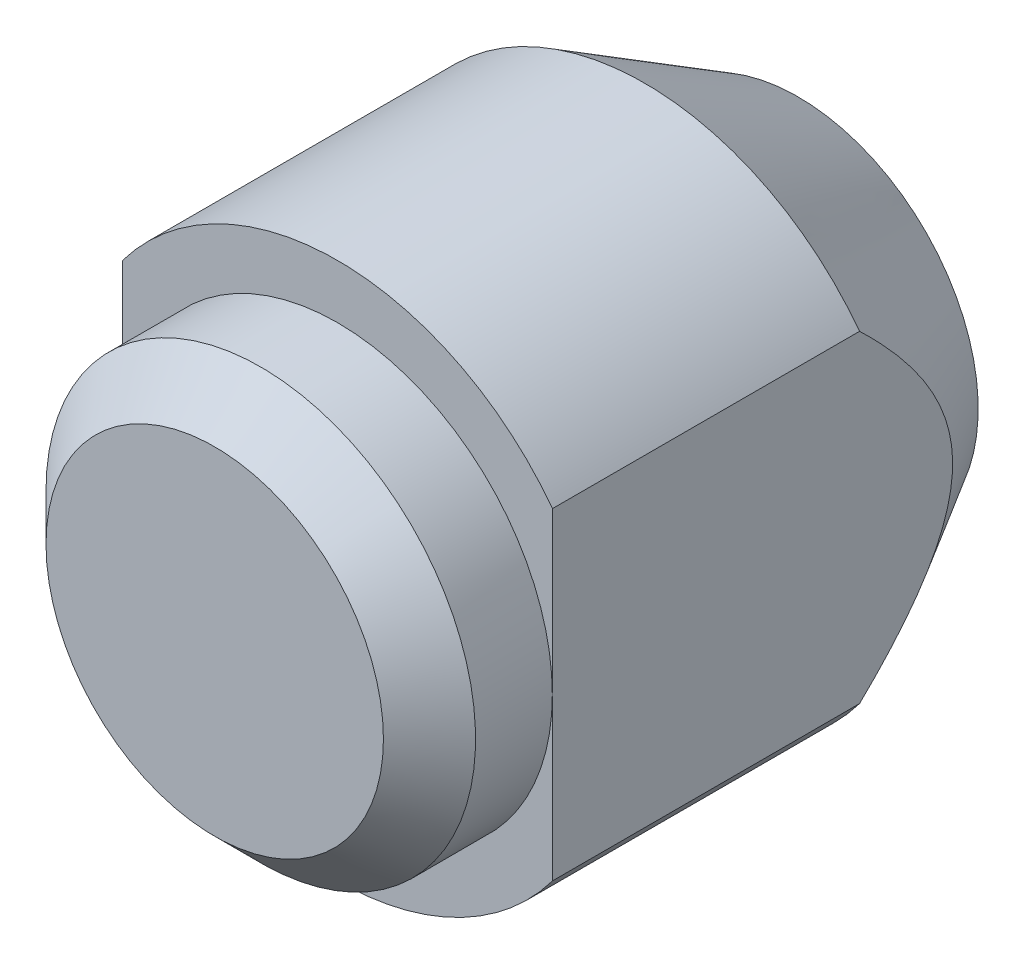
ISO-10303-21;
HEADER;
FILE_DESCRIPTION(('STEP AP214'),'2;1');
FILE_NAME('part.step','',(''),(''),'','','');
FILE_SCHEMA(('AUTOMOTIVE_DESIGN { 1 0 10303 214 1 1 1 1 }'));
ENDSEC;
DATA;
#1=APPLICATION_CONTEXT('core data for automotive mechanical design processes');
#2=APPLICATION_PROTOCOL_DEFINITION('international standard','automotive_design',2000,#1);
#3=PRODUCT_CONTEXT('',#1,'mechanical');
#4=PRODUCT('Part','Part','',(#3));
#5=PRODUCT_RELATED_PRODUCT_CATEGORY('part','',(#4));
#6=PRODUCT_DEFINITION_FORMATION('','',#4);
#7=PRODUCT_DEFINITION_CONTEXT('part definition',#1,'design');
#8=PRODUCT_DEFINITION('design','',#6,#7);
#9=PRODUCT_DEFINITION_SHAPE('','',#8);
#10=(LENGTH_UNIT() NAMED_UNIT(*) SI_UNIT(.MILLI.,.METRE.));
#11=(NAMED_UNIT(*) PLANE_ANGLE_UNIT() SI_UNIT($,.RADIAN.));
#12=(NAMED_UNIT(*) SI_UNIT($,.STERADIAN.) SOLID_ANGLE_UNIT());
#13=UNCERTAINTY_MEASURE_WITH_UNIT(LENGTH_MEASURE(1.E-05),#10,'distance_accuracy_value','');
#14=(GEOMETRIC_REPRESENTATION_CONTEXT(3) GLOBAL_UNCERTAINTY_ASSIGNED_CONTEXT((#13)) GLOBAL_UNIT_ASSIGNED_CONTEXT((#10,
#11,#12)) REPRESENTATION_CONTEXT('',''));
#15=CARTESIAN_POINT('',(0.,0.,0.));
#16=DIRECTION('',(0.,0.,1.));
#17=DIRECTION('',(1.,0.,0.));
#18=AXIS2_PLACEMENT_3D('',#15,#16,#17);
#19=CARTESIAN_POINT('',(28.5841456793605,-59.6905446659548,2.));
#20=DIRECTION('',(0.,0.,-1.));
#21=DIRECTION('',(-1.,0.,0.));
#22=AXIS2_PLACEMENT_3D('',#19,#20,#21);
#23=CYLINDRICAL_SURFACE('',#22,1.75);
#24=CARTESIAN_POINT('',(28.5841456793605,-59.6905446659548,2.));
#25=DIRECTION('',(0.,0.,1.));
#26=DIRECTION('',(1.,0.,0.));
#27=AXIS2_PLACEMENT_3D('',#24,#25,#26);
#28=CIRCLE('',#27,1.75);
#29=CARTESIAN_POINT('',(27.1841456793605,-60.7405446659548,2.));
#30=VERTEX_POINT('',#29);
#31=CARTESIAN_POINT('',(29.9841456793605,-60.7405446659548,2.));
#32=VERTEX_POINT('',#31);
#33=EDGE_CURVE('E104',#30,#32,#28,.T.);
#34=ORIENTED_EDGE('',*,*,#33,.F.);
#35=DIRECTION('',(0.,0.,-1.));
#36=VECTOR('',#35,1.);
#37=CARTESIAN_POINT('',(27.1841456793605,-60.7405446659548,2.));
#38=LINE('',#37,#36);
#39=CARTESIAN_POINT('',(27.1841456793605,-60.7405446659548,0.));
#40=VERTEX_POINT('',#39);
#41=EDGE_CURVE('E207',#30,#40,#38,.T.);
#42=ORIENTED_EDGE('',*,*,#41,.T.);
#43=CARTESIAN_POINT('',(28.5841456793605,-59.6905446659548,0.));
#44=DIRECTION('',(0.,0.,-1.));
#45=DIRECTION('',(-1.,0.,0.));
#46=AXIS2_PLACEMENT_3D('',#43,#44,#45);
#47=CIRCLE('',#46,1.75);
#48=CARTESIAN_POINT('',(29.9841456793605,-60.7405446659548,0.));
#49=VERTEX_POINT('',#48);
#50=EDGE_CURVE('E106',#49,#40,#47,.T.);
#51=ORIENTED_EDGE('',*,*,#50,.F.);
#52=DIRECTION('',(0.,0.,-1.));
#53=VECTOR('',#52,1.);
#54=CARTESIAN_POINT('',(29.9841456793605,-60.7405446659548,2.));
#55=LINE('',#54,#53);
#56=EDGE_CURVE('E67',#49,#32,#55,.F.);
#57=ORIENTED_EDGE('',*,*,#56,.T.);
#58=EDGE_LOOP('',(#34,#42,#51,#57));
#59=FACE_BOUND('',#58,.T.);
#60=ADVANCED_FACE('F45',(#59),#23,.T.);
#61=CARTESIAN_POINT('',(27.1841456793605,-58.6405446659548,0.));
#62=VERTEX_POINT('',#61);
#63=CARTESIAN_POINT('',(29.9841456793605,-58.6405446659548,0.));
#64=VERTEX_POINT('',#63);
#65=EDGE_CURVE('E116',#62,#64,#47,.T.);
#66=ORIENTED_EDGE('',*,*,#65,.F.);
#67=DIRECTION('',(0.,0.,-1.));
#68=VECTOR('',#67,1.);
#69=CARTESIAN_POINT('',(27.1841456793605,-58.6405446659548,2.));
#70=LINE('',#69,#68);
#71=CARTESIAN_POINT('',(27.1841456793605,-58.6405446659548,2.));
#72=VERTEX_POINT('',#71);
#73=EDGE_CURVE('E75',#62,#72,#70,.F.);
#74=ORIENTED_EDGE('',*,*,#73,.T.);
#75=CARTESIAN_POINT('',(29.9841456793605,-58.6405446659548,2.));
#76=VERTEX_POINT('',#75);
#77=EDGE_CURVE('E111',#76,#72,#28,.T.);
#78=ORIENTED_EDGE('',*,*,#77,.F.);
#79=DIRECTION('',(0.,0.,-1.));
#80=VECTOR('',#79,1.);
#81=CARTESIAN_POINT('',(29.9841456793605,-58.6405446659548,2.));
#82=LINE('',#81,#80);
#83=EDGE_CURVE('E93',#76,#64,#82,.T.);
#84=ORIENTED_EDGE('',*,*,#83,.T.);
#85=EDGE_LOOP('',(#66,#74,#78,#84));
#86=FACE_BOUND('',#85,.T.);
#87=ADVANCED_FACE('F147',(#86),#23,.T.);
#88=CARTESIAN_POINT('',(28.5841456793605,-59.6905446659548,2.));
#89=DIRECTION('',(0.,0.,1.));
#90=DIRECTION('',(1.,0.,0.));
#91=AXIS2_PLACEMENT_3D('',#88,#89,#90);
#92=PLANE('',#91);
#93=DIRECTION('',(0.,-1.,0.));
#94=VECTOR('',#93,1.);
#95=CARTESIAN_POINT('',(27.1841456793605,-62.0345831861197,2.));
#96=LINE('',#95,#94);
#97=EDGE_CURVE('E98',#72,#30,#96,.T.);
#98=ORIENTED_EDGE('',*,*,#97,.T.);
#99=ORIENTED_EDGE('',*,*,#33,.T.);
#100=DIRECTION('',(0.,1.,0.));
#101=VECTOR('',#100,1.);
#102=CARTESIAN_POINT('',(29.9841456793605,-62.0345831861197,2.));
#103=LINE('',#102,#101);
#104=EDGE_CURVE('E90',#32,#76,#103,.T.);
#105=ORIENTED_EDGE('',*,*,#104,.T.);
#106=ORIENTED_EDGE('',*,*,#77,.T.);
#107=EDGE_LOOP('',(#98,#99,#105,#106));
#108=FACE_BOUND('',#107,.T.);
#109=CARTESIAN_POINT('',(28.5841456793605,-59.6905446659548,2.));
#110=DIRECTION('',(0.,0.,1.));
#111=DIRECTION('',(1.,0.,0.));
#112=AXIS2_PLACEMENT_3D('',#109,#110,#111);
#113=CIRCLE('',#112,1.39889857999126);
#114=CARTESIAN_POINT('',(29.9830442593518,-59.6905446659548,2.));
#115=VERTEX_POINT('',#114);
#116=EDGE_CURVE('E114',#115,#115,#113,.T.);
#117=ORIENTED_EDGE('',*,*,#116,.F.);
#118=EDGE_LOOP('',(#117));
#119=FACE_BOUND('',#118,.T.);
#120=ADVANCED_FACE('F109',(#108,#119),#92,.T.);
#121=CARTESIAN_POINT('',(28.5841456793605,-59.6905446659548,2.8));
#122=DIRECTION('',(0.,0.,-1.));
#123=DIRECTION('',(-1.,0.,0.));
#124=AXIS2_PLACEMENT_3D('',#121,#122,#123);
#125=CYLINDRICAL_SURFACE('',#124,1.39889857999126);
#126=CARTESIAN_POINT('',(28.5841456793605,-59.6905446659548,2.5));
#127=DIRECTION('',(0.,0.,1.));
#128=DIRECTION('',(1.,0.,0.));
#129=AXIS2_PLACEMENT_3D('',#126,#127,#128);
#130=CIRCLE('',#129,1.39889857999126);
#131=CARTESIAN_POINT('',(27.1852470993693,-59.6905446659548,2.5));
#132=VERTEX_POINT('',#131);
#133=EDGE_CURVE('E123',#132,#132,#130,.F.);
#134=ORIENTED_EDGE('',*,*,#133,.T.);
#135=EDGE_LOOP('',(#134));
#136=FACE_BOUND('',#135,.T.);
#137=ORIENTED_EDGE('',*,*,#116,.T.);
#138=EDGE_LOOP('',(#137));
#139=FACE_BOUND('',#138,.T.);
#140=ADVANCED_FACE('F155',(#136,#139),#125,.T.);
#141=CARTESIAN_POINT('',(28.5841456793605,-59.6905446659548,2.8));
#142=DIRECTION('',(0.,0.,1.));
#143=DIRECTION('',(1.,0.,0.));
#144=AXIS2_PLACEMENT_3D('',#141,#142,#143);
#145=PLANE('',#144);
#146=CARTESIAN_POINT('',(28.5841456793605,-59.6905446659548,2.8));
#147=DIRECTION('',(0.,0.,1.));
#148=DIRECTION('',(1.,0.,0.));
#149=AXIS2_PLACEMENT_3D('',#146,#147,#148);
#150=CIRCLE('',#149,1.09889857999126);
#151=CARTESIAN_POINT('',(27.4852470993693,-59.6905446659548,2.8));
#152=VERTEX_POINT('',#151);
#153=EDGE_CURVE('E120',#152,#152,#150,.T.);
#154=ORIENTED_EDGE('',*,*,#153,.T.);
#155=EDGE_LOOP('',(#154));
#156=FACE_BOUND('',#155,.T.);
#157=ADVANCED_FACE('F157',(#156),#145,.T.);
#158=CARTESIAN_POINT('',(28.5841456793605,-59.6905446659548,2.8));
#159=DIRECTION('',(0.,0.,-1.));
#160=DIRECTION('',(-1.,0.,0.));
#161=AXIS2_PLACEMENT_3D('',#158,#159,#160);
#162=CONICAL_SURFACE('',#161,1.09889857999126,0.785398163397452);
#163=CARTESIAN_POINT('',(27.1852470993693,-59.6905446659548,2.5));
#164=CARTESIAN_POINT('',(27.1883720993692,-59.6905446659548,2.503125));
#165=CARTESIAN_POINT('',(27.1914970993693,-59.6905446659548,2.50625));
#166=CARTESIAN_POINT('',(27.1977470993692,-59.6905446659548,2.5125));
#167=CARTESIAN_POINT('',(27.2008720993693,-59.6905446659548,2.515625));
#168=CARTESIAN_POINT('',(27.2071220993693,-59.6905446659548,2.521875));
#169=CARTESIAN_POINT('',(27.2102470993693,-59.6905446659548,2.525));
#170=CARTESIAN_POINT('',(27.2164970993693,-59.6905446659548,2.53125));
#171=CARTESIAN_POINT('',(27.2196220993692,-59.6905446659548,2.534375));
#172=CARTESIAN_POINT('',(27.2258720993693,-59.6905446659548,2.540625));
#173=CARTESIAN_POINT('',(27.2289970993693,-59.6905446659548,2.54375));
#174=CARTESIAN_POINT('',(27.2352470993693,-59.6905446659548,2.55));
#175=CARTESIAN_POINT('',(27.2383720993693,-59.6905446659548,2.553125));
#176=CARTESIAN_POINT('',(27.2446220993693,-59.6905446659548,2.559375));
#177=CARTESIAN_POINT('',(27.2477470993693,-59.6905446659548,2.5625));
#178=CARTESIAN_POINT('',(27.2539970993693,-59.6905446659548,2.56875));
#179=CARTESIAN_POINT('',(27.2571220993693,-59.6905446659548,2.571875));
#180=CARTESIAN_POINT('',(27.2633720993693,-59.6905446659548,2.578125));
#181=CARTESIAN_POINT('',(27.2664970993693,-59.6905446659548,2.58125));
#182=CARTESIAN_POINT('',(27.2727470993693,-59.6905446659548,2.5875));
#183=CARTESIAN_POINT('',(27.2758720993693,-59.6905446659548,2.590625));
#184=CARTESIAN_POINT('',(27.2821220993692,-59.6905446659548,2.596875));
#185=CARTESIAN_POINT('',(27.2852470993693,-59.6905446659548,2.6));
#186=CARTESIAN_POINT('',(27.2914970993693,-59.6905446659548,2.60625));
#187=CARTESIAN_POINT('',(27.2946220993693,-59.6905446659548,2.609375));
#188=CARTESIAN_POINT('',(27.3008720993693,-59.6905446659548,2.615625));
#189=CARTESIAN_POINT('',(27.3039970993693,-59.6905446659548,2.61875));
#190=CARTESIAN_POINT('',(27.3102470993693,-59.6905446659548,2.625));
#191=CARTESIAN_POINT('',(27.3133720993692,-59.6905446659548,2.628125));
#192=CARTESIAN_POINT('',(27.3196220993693,-59.6905446659548,2.634375));
#193=CARTESIAN_POINT('',(27.3227470993693,-59.6905446659548,2.6375));
#194=CARTESIAN_POINT('',(27.3289970993693,-59.6905446659548,2.64375));
#195=CARTESIAN_POINT('',(27.3321220993693,-59.6905446659548,2.646875));
#196=CARTESIAN_POINT('',(27.3383720993693,-59.6905446659548,2.653125));
#197=CARTESIAN_POINT('',(27.3414970993693,-59.6905446659548,2.65625));
#198=CARTESIAN_POINT('',(27.3477470993693,-59.6905446659548,2.6625));
#199=CARTESIAN_POINT('',(27.3508720993693,-59.6905446659548,2.665625));
#200=CARTESIAN_POINT('',(27.3571220993693,-59.6905446659548,2.671875));
#201=CARTESIAN_POINT('',(27.3602470993693,-59.6905446659548,2.675));
#202=CARTESIAN_POINT('',(27.3664970993693,-59.6905446659548,2.68125));
#203=CARTESIAN_POINT('',(27.3696220993693,-59.6905446659548,2.684375));
#204=CARTESIAN_POINT('',(27.3758720993692,-59.6905446659548,2.690625));
#205=CARTESIAN_POINT('',(27.3789970993693,-59.6905446659548,2.69375));
#206=CARTESIAN_POINT('',(27.3852470993693,-59.6905446659548,2.7));
#207=CARTESIAN_POINT('',(27.3883720993693,-59.6905446659548,2.703125));
#208=CARTESIAN_POINT('',(27.3946220993693,-59.6905446659548,2.709375));
#209=CARTESIAN_POINT('',(27.3977470993693,-59.6905446659548,2.7125));
#210=CARTESIAN_POINT('',(27.4039970993693,-59.6905446659548,2.71875));
#211=CARTESIAN_POINT('',(27.4071220993693,-59.6905446659548,2.721875));
#212=CARTESIAN_POINT('',(27.4133720993693,-59.6905446659548,2.728125));
#213=CARTESIAN_POINT('',(27.4164970993693,-59.6905446659548,2.73125));
#214=CARTESIAN_POINT('',(27.4227470993693,-59.6905446659548,2.7375));
#215=CARTESIAN_POINT('',(27.4258720993693,-59.6905446659548,2.740625));
#216=CARTESIAN_POINT('',(27.4321220993693,-59.6905446659548,2.746875));
#217=CARTESIAN_POINT('',(27.4352470993693,-59.6905446659548,2.75));
#218=CARTESIAN_POINT('',(27.4414970993693,-59.6905446659548,2.75625));
#219=CARTESIAN_POINT('',(27.4446220993693,-59.6905446659548,2.759375));
#220=CARTESIAN_POINT('',(27.4508720993693,-59.6905446659548,2.765625));
#221=CARTESIAN_POINT('',(27.4539970993693,-59.6905446659548,2.76875));
#222=CARTESIAN_POINT('',(27.4602470993693,-59.6905446659548,2.775));
#223=CARTESIAN_POINT('',(27.4633720993693,-59.6905446659548,2.778125));
#224=CARTESIAN_POINT('',(27.4696220993692,-59.6905446659548,2.784375));
#225=CARTESIAN_POINT('',(27.4727470993693,-59.6905446659548,2.7875));
#226=CARTESIAN_POINT('',(27.4789970993693,-59.6905446659548,2.79375));
#227=CARTESIAN_POINT('',(27.4821220993693,-59.6905446659548,2.796875));
#228=CARTESIAN_POINT('',(27.4852470993693,-59.6905446659548,2.8));
#229=B_SPLINE_CURVE_WITH_KNOTS('',3,(#163,#164,#165,#166,#167,#168,#169,#170,#171,#172,#173,
#174,#175,#176,#177,#178,#179,#180,#181,#182,#183,#184,#185,#186,#187,#188,#189,#190,#191,#192,
#193,#194,#195,#196,#197,#198,#199,#200,#201,#202,#203,#204,#205,#206,#207,#208,#209,#210,#211,
#212,#213,#214,#215,#216,#217,#218,#219,#220,#221,#222,#223,#224,#225,#226,#227,#228),
.UNSPECIFIED.,.F.,.F.,(4,2,2,2,2,2,2,2,2,2,2,2,2,2,2,2,2,2,2,2,2,2,2,2,2,2,2,2,2,2,2,2,4),(0.,
0.0132582521472472,0.0265165042944966,0.0397747564417435,0.0530330085889904,0.0662912607362401,
0.079549512883487,0.0928077650307339,0.106066017177984,0.119324269325231,0.132582521472477,
0.145840773619727,0.159099025766974,0.172357277914221,0.185615530061468,0.198873782208718,
0.212132034355965,0.225390286503211,0.238648538650461,0.251906790797708,0.265165042944955,
0.278423295092204,0.291681547239451,0.304939799386698,0.318198051533948,0.331456303681195,
0.344714555828442,0.357972807975689,0.371231060122938,0.384489312270185,0.397747564417432,
0.411005816564682,0.424264068711929),.UNSPECIFIED.);
#230=EDGE_CURVE('BSEAM48',#132,#152,#229,.T.);
#231=ORIENTED_EDGE('',*,*,#133,.F.);
#232=ORIENTED_EDGE('',*,*,#153,.F.);
#233=ORIENTED_EDGE('',*,*,#230,.T.);
#234=ORIENTED_EDGE('',*,*,#230,.F.);
#235=EDGE_LOOP('',(#231,#233,#232,#234));
#236=FACE_BOUND('',#235,.T.);
#237=ADVANCED_FACE('F48',(#236),#162,.T.);
#238=CARTESIAN_POINT('',(28.5841456793605,-59.6905446659548,0.));
#239=DIRECTION('',(0.,0.,1.));
#240=DIRECTION('',(-1.,0.,0.));
#241=AXIS2_PLACEMENT_3D('',#238,#239,#240);
#242=CONICAL_SURFACE('',#241,1.75,0.523598775598299);
#243=CARTESIAN_POINT('',(28.5841456793605,-59.6905446659548,-1.));
#244=DIRECTION('',(0.,0.,-1.));
#245=DIRECTION('',(-1.,0.,0.));
#246=AXIS2_PLACEMENT_3D('',#243,#244,#245);
#247=CIRCLE('',#246,1.17264973081037);
#248=CARTESIAN_POINT('',(27.4114959485501,-59.6905446659548,-1.));
#249=VERTEX_POINT('',#248);
#250=EDGE_CURVE('E112',#249,#249,#247,.T.);
#251=ORIENTED_EDGE('',*,*,#250,.F.);
#252=EDGE_LOOP('',(#251));
#253=FACE_BOUND('',#252,.T.);
#254=ORIENTED_EDGE('',*,*,#50,.T.);
#255=CARTESIAN_POINT('',(27.1841456793605,-63.2788046374986,3.64025494464026));
#256=CARTESIAN_POINT('',(27.1841456793605,-63.2028551078065,3.5177154904068));
#257=CARTESIAN_POINT('',(27.1841456793605,-63.1266849987384,3.39531197807219));
#258=CARTESIAN_POINT('',(27.1841456793605,-62.973784901855,3.15084972417008));
#259=CARTESIAN_POINT('',(27.1841456793605,-62.8970548959029,3.02879099395048));
#260=CARTESIAN_POINT('',(27.1841456793605,-62.7428098536347,2.78492311240664));
#261=CARTESIAN_POINT('',(27.1841456793605,-62.6652938431823,2.66311457656577));
#262=CARTESIAN_POINT('',(27.1841456793605,-62.5094234261319,2.420037292823));
#263=CARTESIAN_POINT('',(27.1841456793605,-62.4310690331252,2.29876853621555));
#264=CARTESIAN_POINT('',(27.1841456793605,-62.2721367381953,2.05513587442795));
#265=CARTESIAN_POINT('',(27.1841456793605,-62.1915430874788,1.93278222689912));
#266=CARTESIAN_POINT('',(27.1841456793605,-62.0289464796102,1.68901557163256));
#267=CARTESIAN_POINT('',(27.1841456793605,-61.9469435464078,1.56760254796036));
#268=CARTESIAN_POINT('',(27.1841456793605,-61.7811200548576,1.32614257641916));
#269=CARTESIAN_POINT('',(27.1841456793605,-61.6973007752614,1.20609475274276));
#270=CARTESIAN_POINT('',(27.1841456793605,-61.527110007111,0.967828396811744));
#271=CARTESIAN_POINT('',(27.1841456793605,-61.440738786021,0.849609674817341));
#272=CARTESIAN_POINT('',(27.1841456793605,-61.288717440399,0.648234073899523));
#273=CARTESIAN_POINT('',(27.1841456793605,-61.2239410832832,0.564420544135965));
#274=CARTESIAN_POINT('',(27.1841456793605,-61.0917745176014,0.398790871091219));
#275=CARTESIAN_POINT('',(27.1841456793605,-61.0243828035863,0.316975923737619));
#276=CARTESIAN_POINT('',(27.1841456793605,-60.8857693040301,0.156018389125334));
#277=CARTESIAN_POINT('',(27.1841456793605,-60.8145329484072,0.076888133488506));
#278=CARTESIAN_POINT('',(27.1841456793605,-60.7038799768751,-0.0381016725232494));
#279=CARTESIAN_POINT('',(27.1841456793605,-60.6663796127569,-0.0757985132897407));
#280=CARTESIAN_POINT('',(27.1841456793605,-60.5898309363511,-0.149578927965754));
#281=CARTESIAN_POINT('',(27.1841456793605,-60.5507828357378,-0.185662721055449));
#282=CARTESIAN_POINT('',(27.1841456793605,-60.4700068505267,-0.256386047979585));
#283=CARTESIAN_POINT('',(27.1841456793605,-60.428241706338,-0.290984060918426));
#284=CARTESIAN_POINT('',(27.1841456793605,-60.3423676019086,-0.357110533889939));
#285=CARTESIAN_POINT('',(27.1841456793605,-60.2982568253209,-0.388636560003023));
#286=CARTESIAN_POINT('',(27.1841456793605,-60.1626220901972,-0.476160611284937));
#287=CARTESIAN_POINT('',(27.1841456793605,-60.0666401063908,-0.526205829184844));
#288=CARTESIAN_POINT('',(27.1841456793605,-59.9168557668179,-0.576097786497128));
#289=CARTESIAN_POINT('',(27.1841456793605,-59.867329996221,-0.588506366873647));
#290=CARTESIAN_POINT('',(27.1841456793605,-59.7667984711925,-0.604165695673143));
#291=CARTESIAN_POINT('',(27.1841456793605,-59.7157934149686,-0.607420695648853));
#292=CARTESIAN_POINT('',(27.1841456793605,-59.6140747962394,-0.604203472036323));
#293=CARTESIAN_POINT('',(27.1841456793605,-59.5633614359017,-0.597725166011105));
#294=CARTESIAN_POINT('',(27.1841456793605,-59.4638362542384,-0.576128021342114));
#295=CARTESIAN_POINT('',(27.1841456793605,-59.4150269372348,-0.560998187511094));
#296=CARTESIAN_POINT('',(27.1841456793605,-59.2960525919526,-0.514692242649102));
#297=CARTESIAN_POINT('',(27.1841456793605,-59.2275714675667,-0.479270683262138));
#298=CARTESIAN_POINT('',(27.1841456793605,-59.1292514986215,-0.419132386112115));
#299=CARTESIAN_POINT('',(27.1841456793605,-59.0971352063037,-0.39785504358995));
#300=CARTESIAN_POINT('',(27.1841456793605,-59.0342209532746,-0.353437830831702));
#301=CARTESIAN_POINT('',(27.1841456793605,-59.0034224732805,-0.330298704778267));
#302=CARTESIAN_POINT('',(27.1841456793605,-58.9092726517667,-0.255951500781514));
#303=CARTESIAN_POINT('',(27.1841456793605,-58.847926147455,-0.202221391999554));
#304=CARTESIAN_POINT('',(27.1841456793605,-58.7290361358558,-0.0906736961401364));
#305=CARTESIAN_POINT('',(27.1841456793605,-58.6714970732059,-0.0328514895110427));
#306=CARTESIAN_POINT('',(27.1841456793605,-58.5591154706364,0.0857085146290953));
#307=CARTESIAN_POINT('',(27.1841456793605,-58.5042826821626,0.1464554897607));
#308=CARTESIAN_POINT('',(27.1841456793605,-58.3968167012521,0.269873488513997));
#309=CARTESIAN_POINT('',(27.1841456793605,-58.3441840116256,0.332544946341058));
#310=CARTESIAN_POINT('',(27.1841456793605,-58.2400222085853,0.460032138605707));
#311=CARTESIAN_POINT('',(27.1841456793605,-58.188513481504,0.524864459199608));
#312=CARTESIAN_POINT('',(27.1841456793605,-58.0868822747454,0.65560900764918));
#313=CARTESIAN_POINT('',(27.1841456793605,-58.0367598851022,0.721521305202036));
#314=CARTESIAN_POINT('',(27.1841456793605,-57.8882694935692,0.920197104753584));
#315=CARTESIAN_POINT('',(27.1841456793605,-57.7915465712673,1.05418895621352));
#316=CARTESIAN_POINT('',(27.1841456793605,-57.624780288512,1.29061929756648));
#317=CARTESIAN_POINT('',(27.1841456793605,-57.5540906602818,1.39260690442808));
#318=CARTESIAN_POINT('',(27.1841456793605,-57.4140103849412,1.5974744817496));
#319=CARTESIAN_POINT('',(27.1841456793605,-57.3446197721709,1.70035447569519));
#320=CARTESIAN_POINT('',(27.1841456793605,-57.1378424809317,2.01018231926447));
#321=CARTESIAN_POINT('',(27.1841456793605,-57.0019733760809,2.21814127730237));
#322=CARTESIAN_POINT('',(27.1841456793605,-56.7378451482029,2.62801651223192));
#323=CARTESIAN_POINT('',(27.1841456793605,-56.6094904873633,2.82987157041775));
#324=CARTESIAN_POINT('',(27.1841456793605,-56.4183223638586,3.1333563579214));
#325=CARTESIAN_POINT('',(27.1841456793605,-56.3548615365173,3.23457905726749));
#326=CARTESIAN_POINT('',(27.1841456793605,-56.2283104767477,3.4372542522619));
#327=CARTESIAN_POINT('',(27.1841456793605,-56.1652202399703,3.53870674519411));
#328=CARTESIAN_POINT('',(27.1841456793605,-56.102284694411,3.64025494464026));
#329=B_SPLINE_CURVE_WITH_KNOTS('',3,(#255,#256,#257,#258,#259,#260,#261,#262,#263,#264,#265,
#266,#267,#268,#269,#270,#271,#272,#273,#274,#275,#276,#277,#278,#279,#280,#281,#282,#283,#284,
#285,#286,#287,#288,#289,#290,#291,#292,#293,#294,#295,#296,#297,#298,#299,#300,#301,#302,#303,
#304,#305,#306,#307,#308,#309,#310,#311,#312,#313,#314,#315,#316,#317,#318,#319,#320,#321,#322,
#323,#324,#325,#326,#327,#328),.UNSPECIFIED.,.F.,.F.,(4,2,2,2,2,2,2,2,2,2,2,2,2,2,2,2,2,2,2,2,2,
2,2,2,2,2,2,2,2,2,2,2,2,2,2,2,4),(0.,0.432503049685799,0.865020172343219,1.29816226801199,
1.73129735246927,2.17082598559394,2.61034715661447,3.04956834872067,3.48874366904183,
3.80648902019744,4.12442006638399,4.44365459526394,4.60313401936663,4.76259170719775,
4.9251384868944,5.08781302193333,5.40840507643369,5.5608732752973,5.71327064573004,
5.8657632903712,6.01845016932647,6.24835820997732,6.36390586525929,6.47940756170324,
6.72373148408354,6.96833576321857,7.21376520718667,7.45925043825838,7.70763611498804,
7.95603788512236,8.45172980208288,8.82399385000227,9.19626772500276,9.9414613985472,
10.6590747679791,11.0174869594712,11.3758949364936),.UNSPECIFIED.);
#330=EDGE_CURVE('E11',#40,#62,#329,.T.);
#331=ORIENTED_EDGE('',*,*,#330,.T.);
#332=ORIENTED_EDGE('',*,*,#65,.T.);
#333=CARTESIAN_POINT('',(29.9841456793605,-56.102284694411,3.64025494464026));
#334=CARTESIAN_POINT('',(29.9841456793605,-56.1782342241031,3.5177154904068));
#335=CARTESIAN_POINT('',(29.9841456793605,-56.2544043331712,3.3953119780722));
#336=CARTESIAN_POINT('',(29.9841456793605,-56.4073044300546,3.15084972417009));
#337=CARTESIAN_POINT('',(29.9841456793605,-56.4840344360067,3.02879099395048));
#338=CARTESIAN_POINT('',(29.9841456793605,-56.638279478275,2.78492311240664));
#339=CARTESIAN_POINT('',(29.9841456793605,-56.7157954887273,2.66311457656578));
#340=CARTESIAN_POINT('',(29.9841456793605,-56.8716659057777,2.42003729282301));
#341=CARTESIAN_POINT('',(29.9841456793605,-56.9500202987844,2.29876853621555));
#342=CARTESIAN_POINT('',(29.9841456793605,-57.1089525937143,2.05513587442795));
#343=CARTESIAN_POINT('',(29.9841456793605,-57.1895462444308,1.93278222689912));
#344=CARTESIAN_POINT('',(29.9841456793605,-57.3521428522994,1.68901557163256));
#345=CARTESIAN_POINT('',(29.9841456793605,-57.4341457855018,1.56760254796037));
#346=CARTESIAN_POINT('',(29.9841456793605,-57.599969277052,1.32614257641916));
#347=CARTESIAN_POINT('',(29.9841456793605,-57.6837885566482,1.20609475274276));
#348=CARTESIAN_POINT('',(29.9841456793605,-57.8539793247986,0.967828396811744));
#349=CARTESIAN_POINT('',(29.9841456793605,-57.9403505458886,0.849609674817341));
#350=CARTESIAN_POINT('',(29.9841456793605,-58.0923718915106,0.648234073899523));
#351=CARTESIAN_POINT('',(29.9841456793605,-58.1571482486265,0.564420544135965));
#352=CARTESIAN_POINT('',(29.9841456793605,-58.2893148143082,0.39879087109122));
#353=CARTESIAN_POINT('',(29.9841456793605,-58.3567065283233,0.316975923737622));
#354=CARTESIAN_POINT('',(29.9841456793605,-58.4953200278795,0.156018389125335));
#355=CARTESIAN_POINT('',(29.9841456793605,-58.5665563835024,0.0768881334885053));
#356=CARTESIAN_POINT('',(29.9841456793605,-58.6772093550345,-0.0381016725232481));
#357=CARTESIAN_POINT('',(29.9841456793605,-58.7147097191527,-0.0757985132897376));
#358=CARTESIAN_POINT('',(29.9841456793605,-58.7912583955585,-0.149578927965751));
#359=CARTESIAN_POINT('',(29.9841456793605,-58.8303064961718,-0.185662721055449));
#360=CARTESIAN_POINT('',(29.9841456793605,-58.9110824813829,-0.256386047979586));
#361=CARTESIAN_POINT('',(29.9841456793605,-58.9528476255716,-0.290984060918428));
#362=CARTESIAN_POINT('',(29.9841456793605,-59.038721730001,-0.357110533889941));
#363=CARTESIAN_POINT('',(29.9841456793605,-59.0828325065887,-0.388636560003024));
#364=CARTESIAN_POINT('',(29.9841456793605,-59.2184672417124,-0.476160611284938));
#365=CARTESIAN_POINT('',(29.9841456793605,-59.3144492255188,-0.526205829184844));
#366=CARTESIAN_POINT('',(29.9841456793605,-59.4642335650917,-0.576097786497128));
#367=CARTESIAN_POINT('',(29.9841456793605,-59.5137593356886,-0.588506366873647));
#368=CARTESIAN_POINT('',(29.9841456793605,-59.6142908607171,-0.604165695673143));
#369=CARTESIAN_POINT('',(29.9841456793605,-59.665295916941,-0.607420695648853));
#370=CARTESIAN_POINT('',(29.9841456793605,-59.7670145356702,-0.604203472036323));
#371=CARTESIAN_POINT('',(29.9841456793605,-59.8177278960079,-0.597725166011106));
#372=CARTESIAN_POINT('',(29.9841456793605,-59.9172530776712,-0.576128021342115));
#373=CARTESIAN_POINT('',(29.9841456793605,-59.9660623946748,-0.560998187511095));
#374=CARTESIAN_POINT('',(29.9841456793605,-60.085036739957,-0.514692242649102));
#375=CARTESIAN_POINT('',(29.9841456793605,-60.1535178643429,-0.479270683262138));
#376=CARTESIAN_POINT('',(29.9841456793605,-60.2518378332881,-0.419132386112115));
#377=CARTESIAN_POINT('',(29.9841456793605,-60.2839541256059,-0.39785504358995));
#378=CARTESIAN_POINT('',(29.9841456793605,-60.346868378635,-0.353437830831702));
#379=CARTESIAN_POINT('',(29.9841456793605,-60.3776668586291,-0.330298704778267));
#380=CARTESIAN_POINT('',(29.9841456793605,-60.4718166801429,-0.255951500781514));
#381=CARTESIAN_POINT('',(29.9841456793605,-60.5331631844546,-0.202221391999554));
#382=CARTESIAN_POINT('',(29.9841456793605,-60.6520531960538,-0.0906736961401365));
#383=CARTESIAN_POINT('',(29.9841456793605,-60.7095922587037,-0.0328514895110431));
#384=CARTESIAN_POINT('',(29.9841456793605,-60.8219738612732,0.0857085146290964));
#385=CARTESIAN_POINT('',(29.9841456793605,-60.876806649747,0.146455489760703));
#386=CARTESIAN_POINT('',(29.9841456793605,-60.9842726306575,0.269873488514));
#387=CARTESIAN_POINT('',(29.9841456793605,-61.036905320284,0.332544946341059));
#388=CARTESIAN_POINT('',(29.9841456793605,-61.1410671233243,0.460032138605707));
#389=CARTESIAN_POINT('',(29.9841456793605,-61.1925758504056,0.524864459199607));
#390=CARTESIAN_POINT('',(29.9841456793605,-61.2942070571642,0.65560900764918));
#391=CARTESIAN_POINT('',(29.9841456793605,-61.3443294468074,0.721521305202036));
#392=CARTESIAN_POINT('',(29.9841456793605,-61.4928198383404,0.920197104753584));
#393=CARTESIAN_POINT('',(29.9841456793605,-61.5895427606423,1.05418895621352));
#394=CARTESIAN_POINT('',(29.9841456793605,-61.7563090433976,1.29061929756648));
#395=CARTESIAN_POINT('',(29.9841456793605,-61.8269986716278,1.39260690442808));
#396=CARTESIAN_POINT('',(29.9841456793605,-61.9670789469683,1.59747448174959));
#397=CARTESIAN_POINT('',(29.9841456793605,-62.0364695597387,1.70035447569518));
#398=CARTESIAN_POINT('',(29.9841456793605,-62.2432468509779,2.01018231926446));
#399=CARTESIAN_POINT('',(29.9841456793605,-62.3791159558287,2.21814127730236));
#400=CARTESIAN_POINT('',(29.9841456793605,-62.6432441837067,2.62801651223192));
#401=CARTESIAN_POINT('',(29.9841456793605,-62.7715988445463,2.82987157041774));
#402=CARTESIAN_POINT('',(29.9841456793605,-62.962766968051,3.13335635792139));
#403=CARTESIAN_POINT('',(29.9841456793605,-63.0262277953923,3.23457905726749));
#404=CARTESIAN_POINT('',(29.9841456793605,-63.152778855162,3.4372542522619));
#405=CARTESIAN_POINT('',(29.9841456793605,-63.2158690919393,3.5387067451941));
#406=CARTESIAN_POINT('',(29.9841456793605,-63.2788046374986,3.64025494464026));
#407=B_SPLINE_CURVE_WITH_KNOTS('',3,(#333,#334,#335,#336,#337,#338,#339,#340,#341,#342,#343,
#344,#345,#346,#347,#348,#349,#350,#351,#352,#353,#354,#355,#356,#357,#358,#359,#360,#361,#362,
#363,#364,#365,#366,#367,#368,#369,#370,#371,#372,#373,#374,#375,#376,#377,#378,#379,#380,#381,
#382,#383,#384,#385,#386,#387,#388,#389,#390,#391,#392,#393,#394,#395,#396,#397,#398,#399,#400,
#401,#402,#403,#404,#405,#406),.UNSPECIFIED.,.F.,.F.,(4,2,2,2,2,2,2,2,2,2,2,2,2,2,2,2,2,2,2,2,2,
2,2,2,2,2,2,2,2,2,2,2,2,2,2,2,4),(0.,0.432503049685798,0.865020172343215,1.29816226801199,
1.73129735246926,2.17082598559394,2.61034715661447,3.04956834872067,3.48874366904183,
3.80648902019744,4.12442006638398,4.44365459526394,4.60313401936663,4.76259170719775,
4.92513848689441,5.08781302193333,5.40840507643369,5.5608732752973,5.71327064573004,
5.86576329037119,6.01845016932647,6.24835820997732,6.36390586525929,6.47940756170324,
6.72373148408354,6.96833576321857,7.21376520718667,7.45925043825837,7.70763611498804,
7.95603788512235,8.45172980208288,8.82399385000226,9.19626772500275,9.9414613985472,
10.6590747679791,11.0174869594712,11.3758949364936),.UNSPECIFIED.);
#408=EDGE_CURVE('E60',#64,#49,#407,.T.);
#409=ORIENTED_EDGE('',*,*,#408,.T.);
#410=EDGE_LOOP('',(#254,#331,#332,#409));
#411=FACE_BOUND('',#410,.T.);
#412=ADVANCED_FACE('F130',(#253,#411),#242,.T.);
#413=CARTESIAN_POINT('',(28.5841456793605,-59.6905446659548,-1.));
#414=DIRECTION('',(0.,0.,-1.));
#415=DIRECTION('',(-1.,0.,0.));
#416=AXIS2_PLACEMENT_3D('',#413,#414,#415);
#417=PLANE('',#416);
#418=ORIENTED_EDGE('',*,*,#250,.T.);
#419=EDGE_LOOP('',(#418));
#420=FACE_BOUND('',#419,.T.);
#421=ADVANCED_FACE('F137',(#420),#417,.T.);
#422=CARTESIAN_POINT('',(29.9841456793605,-62.0345831861197,2.));
#423=DIRECTION('',(-1.,0.,0.));
#424=DIRECTION('',(0.,0.,1.));
#425=AXIS2_PLACEMENT_3D('',#422,#423,#424);
#426=PLANE('',#425);
#427=ORIENTED_EDGE('',*,*,#104,.F.);
#428=ORIENTED_EDGE('',*,*,#56,.F.);
#429=ORIENTED_EDGE('',*,*,#408,.F.);
#430=ORIENTED_EDGE('',*,*,#83,.F.);
#431=EDGE_LOOP('',(#427,#428,#429,#430));
#432=FACE_BOUND('',#431,.T.);
#433=ADVANCED_FACE('F91',(#432),#426,.F.);
#434=CARTESIAN_POINT('',(27.1841456793605,-62.0345831861197,2.));
#435=DIRECTION('',(1.,0.,0.));
#436=DIRECTION('',(0.,0.,-1.));
#437=AXIS2_PLACEMENT_3D('',#434,#435,#436);
#438=PLANE('',#437);
#439=ORIENTED_EDGE('',*,*,#97,.F.);
#440=ORIENTED_EDGE('',*,*,#73,.F.);
#441=ORIENTED_EDGE('',*,*,#330,.F.);
#442=ORIENTED_EDGE('',*,*,#41,.F.);
#443=EDGE_LOOP('',(#439,#440,#441,#442));
#444=FACE_BOUND('',#443,.T.);
#445=ADVANCED_FACE('F136',(#444),#438,.F.);
#446=CLOSED_SHELL('',(#60,#87,#120,#140,#157,#237,#412,#421,#433,#445));
#447=MANIFOLD_SOLID_BREP('B2',#446);
#448=ADVANCED_BREP_SHAPE_REPRESENTATION('',(#18,#447),#14);
#449=SHAPE_DEFINITION_REPRESENTATION(#9,#448);
ENDSEC;
END-ISO-10303-21;
